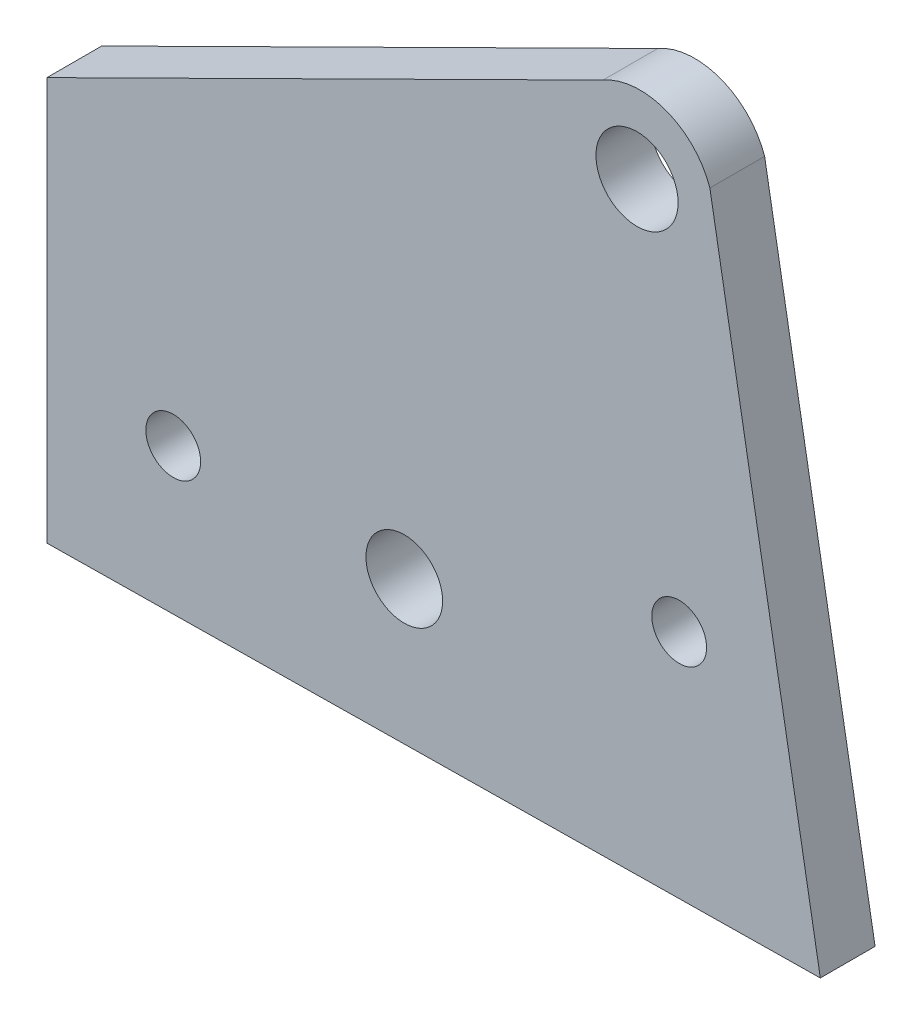
ISO-10303-21;
HEADER;
FILE_DESCRIPTION(('STEP AP214'),'2;1');
FILE_NAME('part.step','',(''),(''),'','','');
FILE_SCHEMA(('AUTOMOTIVE_DESIGN { 1 0 10303 214 1 1 1 1 }'));
ENDSEC;
DATA;
#1=APPLICATION_CONTEXT('core data for automotive mechanical design processes');
#2=APPLICATION_PROTOCOL_DEFINITION('international standard','automotive_design',2000,#1);
#3=PRODUCT_CONTEXT('',#1,'mechanical');
#4=PRODUCT('Part','Part','',(#3));
#5=PRODUCT_RELATED_PRODUCT_CATEGORY('part','',(#4));
#6=PRODUCT_DEFINITION_FORMATION('','',#4);
#7=PRODUCT_DEFINITION_CONTEXT('part definition',#1,'design');
#8=PRODUCT_DEFINITION('design','',#6,#7);
#9=PRODUCT_DEFINITION_SHAPE('','',#8);
#10=(LENGTH_UNIT() NAMED_UNIT(*) SI_UNIT(.MILLI.,.METRE.));
#11=(NAMED_UNIT(*) PLANE_ANGLE_UNIT() SI_UNIT($,.RADIAN.));
#12=(NAMED_UNIT(*) SI_UNIT($,.STERADIAN.) SOLID_ANGLE_UNIT());
#13=UNCERTAINTY_MEASURE_WITH_UNIT(LENGTH_MEASURE(1.E-05),#10,'distance_accuracy_value','');
#14=(GEOMETRIC_REPRESENTATION_CONTEXT(3) GLOBAL_UNCERTAINTY_ASSIGNED_CONTEXT((#13)) GLOBAL_UNIT_ASSIGNED_CONTEXT((#10,
#11,#12)) REPRESENTATION_CONTEXT('',''));
#15=CARTESIAN_POINT('',(0.,0.,0.));
#16=DIRECTION('',(0.,0.,1.));
#17=DIRECTION('',(1.,0.,0.));
#18=AXIS2_PLACEMENT_3D('',#15,#16,#17);
#19=CARTESIAN_POINT('',(-25.2182447600107,16.1874954298186,3.));
#20=DIRECTION('',(0.,0.,1.));
#21=DIRECTION('',(1.,0.,0.));
#22=AXIS2_PLACEMENT_3D('',#19,#20,#21);
#23=PLANE('',#22);
#24=CARTESIAN_POINT('',(-38.1318178832002,-9.42155377075159,3.));
#25=DIRECTION('',(0.,0.,1.));
#26=DIRECTION('',(1.,0.,0.));
#27=AXIS2_PLACEMENT_3D('',#24,#25,#26);
#28=CIRCLE('',#27,2.09999999999999);
#29=CARTESIAN_POINT('',(-36.0318178832002,-9.42155377075159,3.));
#30=VERTEX_POINT('',#29);
#31=EDGE_CURVE('E188',#30,#30,#28,.T.);
#32=ORIENTED_EDGE('',*,*,#31,.F.);
#33=EDGE_LOOP('',(#32));
#34=FACE_BOUND('',#33,.T.);
#35=CARTESIAN_POINT('',(-23.0715020259005,-4.4000567634974,3.));
#36=DIRECTION('',(0.,0.,1.));
#37=DIRECTION('',(1.,0.,0.));
#38=AXIS2_PLACEMENT_3D('',#35,#36,#37);
#39=CIRCLE('',#38,1.5);
#40=CARTESIAN_POINT('',(-21.5715020259005,-4.4000567634974,3.));
#41=VERTEX_POINT('',#40);
#42=EDGE_CURVE('E129',#41,#41,#39,.T.);
#43=ORIENTED_EDGE('',*,*,#42,.F.);
#44=EDGE_LOOP('',(#43));
#45=FACE_BOUND('',#44,.T.);
#46=CARTESIAN_POINT('',(-25.2182447600107,16.1874954298186,3.));
#47=DIRECTION('',(0.,0.,1.));
#48=DIRECTION('',(1.,0.,0.));
#49=AXIS2_PLACEMENT_3D('',#46,#47,#48);
#50=CIRCLE('',#49,4.04503526554854);
#51=CARTESIAN_POINT('',(-21.3908393679764,17.4964179884744,3.));
#52=VERTEX_POINT('',#51);
#53=CARTESIAN_POINT('',(-27.2485410989254,19.6860961609283,3.));
#54=VERTEX_POINT('',#53);
#55=EDGE_CURVE('E132',#52,#54,#50,.T.);
#56=ORIENTED_EDGE('',*,*,#55,.T.);
#57=DIRECTION('',(-0.895799736306299,-0.444457908506043,0.));
#58=VECTOR('',#57,1.);
#59=CARTESIAN_POINT('',(-27.2485410989254,19.6860961609283,3.));
#60=LINE('',#59,#58);
#61=CARTESIAN_POINT('',(-57.7075351426822,4.57363269481127,3.));
#62=VERTEX_POINT('',#61);
#63=EDGE_CURVE('E102',#54,#62,#60,.T.);
#64=ORIENTED_EDGE('',*,*,#63,.T.);
#65=DIRECTION('',(0.,-1.,0.));
#66=VECTOR('',#65,1.);
#67=CARTESIAN_POINT('',(-57.7075351426822,4.57363269481127,3.));
#68=LINE('',#67,#66);
#69=CARTESIAN_POINT('',(-57.7075351426822,-17.5103686240081,3.));
#70=VERTEX_POINT('',#69);
#71=EDGE_CURVE('E103',#62,#70,#68,.T.);
#72=ORIENTED_EDGE('',*,*,#71,.T.);
#73=DIRECTION('',(0.999914768407248,0.0130558768790045,0.));
#74=VECTOR('',#73,1.);
#75=CARTESIAN_POINT('',(-57.7075351426822,-17.5103686240081,3.));
#76=LINE('',#75,#74);
#77=CARTESIAN_POINT('',(-15.3402728475604,-16.9571797146107,3.));
#78=VERTEX_POINT('',#77);
#79=EDGE_CURVE('E106',#70,#78,#76,.T.);
#80=ORIENTED_EDGE('',*,*,#79,.T.);
#81=DIRECTION('',(-0.172967975598911,0.984927448808903,0.));
#82=VECTOR('',#81,1.);
#83=CARTESIAN_POINT('',(-15.3402728475604,-16.9571797146107,3.));
#84=LINE('',#83,#82);
#85=EDGE_CURVE('E70',#78,#52,#84,.T.);
#86=ORIENTED_EDGE('',*,*,#85,.T.);
#87=EDGE_LOOP('',(#56,#64,#72,#80,#86));
#88=FACE_BOUND('',#87,.T.);
#89=CARTESIAN_POINT('',(-50.7876816678338,-9.43546118851268,3.));
#90=DIRECTION('',(0.,0.,1.));
#91=DIRECTION('',(1.,0.,0.));
#92=AXIS2_PLACEMENT_3D('',#89,#90,#91);
#93=CIRCLE('',#92,1.5);
#94=CARTESIAN_POINT('',(-49.2876816678338,-9.43546118851268,3.));
#95=VERTEX_POINT('',#94);
#96=EDGE_CURVE('E193',#95,#95,#93,.T.);
#97=ORIENTED_EDGE('',*,*,#96,.F.);
#98=EDGE_LOOP('',(#97));
#99=FACE_BOUND('',#98,.T.);
#100=CARTESIAN_POINT('',(-25.3818178832002,15.9237372684417,3.));
#101=DIRECTION('',(0.,0.,1.));
#102=DIRECTION('',(1.,0.,0.));
#103=AXIS2_PLACEMENT_3D('',#100,#101,#102);
#104=CIRCLE('',#103,2.25000000000001);
#105=CARTESIAN_POINT('',(-23.1318178832002,15.9237372684417,3.));
#106=VERTEX_POINT('',#105);
#107=EDGE_CURVE('E179',#106,#106,#104,.T.);
#108=ORIENTED_EDGE('',*,*,#107,.F.);
#109=EDGE_LOOP('',(#108));
#110=FACE_BOUND('',#109,.T.);
#111=ADVANCED_FACE('F49',(#34,#45,#88,#99,#110),#23,.T.);
#112=CARTESIAN_POINT('',(-25.2182447600107,16.1874954298186,0.));
#113=DIRECTION('',(0.,0.,1.));
#114=DIRECTION('',(1.,0.,0.));
#115=AXIS2_PLACEMENT_3D('',#112,#113,#114);
#116=PLANE('',#115);
#117=CARTESIAN_POINT('',(-25.2182447600107,16.1874954298186,0.));
#118=DIRECTION('',(0.,0.,1.));
#119=DIRECTION('',(1.,0.,0.));
#120=AXIS2_PLACEMENT_3D('',#117,#118,#119);
#121=CIRCLE('',#120,4.04503526554854);
#122=CARTESIAN_POINT('',(-21.3908393679764,17.4964179884744,0.));
#123=VERTEX_POINT('',#122);
#124=CARTESIAN_POINT('',(-27.2485410989254,19.6860961609283,0.));
#125=VERTEX_POINT('',#124);
#126=EDGE_CURVE('E124',#123,#125,#121,.T.);
#127=ORIENTED_EDGE('',*,*,#126,.F.);
#128=DIRECTION('',(-0.172967975598911,0.984927448808903,0.));
#129=VECTOR('',#128,1.);
#130=CARTESIAN_POINT('',(-15.3402728475604,-16.9571797146107,0.));
#131=LINE('',#130,#129);
#132=CARTESIAN_POINT('',(-15.3402728475604,-16.9571797146107,0.));
#133=VERTEX_POINT('',#132);
#134=EDGE_CURVE('E93',#133,#123,#131,.T.);
#135=ORIENTED_EDGE('',*,*,#134,.F.);
#136=DIRECTION('',(0.999914768407248,0.0130558768790045,0.));
#137=VECTOR('',#136,1.);
#138=CARTESIAN_POINT('',(-57.7075351426822,-17.5103686240081,0.));
#139=LINE('',#138,#137);
#140=CARTESIAN_POINT('',(-57.7075351426822,-17.5103686240081,0.));
#141=VERTEX_POINT('',#140);
#142=EDGE_CURVE('E90',#141,#133,#139,.T.);
#143=ORIENTED_EDGE('',*,*,#142,.F.);
#144=DIRECTION('',(0.,-1.,0.));
#145=VECTOR('',#144,1.);
#146=CARTESIAN_POINT('',(-57.7075351426822,4.57363269481127,0.));
#147=LINE('',#146,#145);
#148=CARTESIAN_POINT('',(-57.7075351426822,4.57363269481127,0.));
#149=VERTEX_POINT('',#148);
#150=EDGE_CURVE('E117',#149,#141,#147,.T.);
#151=ORIENTED_EDGE('',*,*,#150,.F.);
#152=DIRECTION('',(-0.895799736306299,-0.444457908506043,0.));
#153=VECTOR('',#152,1.);
#154=CARTESIAN_POINT('',(-27.2485410989254,19.6860961609283,0.));
#155=LINE('',#154,#153);
#156=EDGE_CURVE('E126',#125,#149,#155,.T.);
#157=ORIENTED_EDGE('',*,*,#156,.F.);
#158=EDGE_LOOP('',(#127,#135,#143,#151,#157));
#159=FACE_BOUND('',#158,.T.);
#160=CARTESIAN_POINT('',(-23.0715020259005,-4.4000567634974,0.));
#161=DIRECTION('',(0.,0.,1.));
#162=DIRECTION('',(1.,0.,0.));
#163=AXIS2_PLACEMENT_3D('',#160,#161,#162);
#164=CIRCLE('',#163,1.5);
#165=CARTESIAN_POINT('',(-21.5715020259005,-4.4000567634974,0.));
#166=VERTEX_POINT('',#165);
#167=EDGE_CURVE('E200',#166,#166,#164,.T.);
#168=ORIENTED_EDGE('',*,*,#167,.T.);
#169=EDGE_LOOP('',(#168));
#170=FACE_BOUND('',#169,.T.);
#171=CARTESIAN_POINT('',(-50.7876816678338,-9.43546118851268,0.));
#172=DIRECTION('',(0.,0.,1.));
#173=DIRECTION('',(1.,0.,0.));
#174=AXIS2_PLACEMENT_3D('',#171,#172,#173);
#175=CIRCLE('',#174,1.5);
#176=CARTESIAN_POINT('',(-49.2876816678338,-9.43546118851268,0.));
#177=VERTEX_POINT('',#176);
#178=EDGE_CURVE('E195',#177,#177,#175,.T.);
#179=ORIENTED_EDGE('',*,*,#178,.T.);
#180=EDGE_LOOP('',(#179));
#181=FACE_BOUND('',#180,.T.);
#182=CARTESIAN_POINT('',(-38.1318178832002,-9.42155377075159,0.));
#183=DIRECTION('',(0.,0.,1.));
#184=DIRECTION('',(1.,0.,0.));
#185=AXIS2_PLACEMENT_3D('',#182,#183,#184);
#186=CIRCLE('',#185,2.09999999999999);
#187=CARTESIAN_POINT('',(-36.0318178832002,-9.42155377075159,0.));
#188=VERTEX_POINT('',#187);
#189=EDGE_CURVE('E186',#188,#188,#186,.T.);
#190=ORIENTED_EDGE('',*,*,#189,.T.);
#191=EDGE_LOOP('',(#190));
#192=FACE_BOUND('',#191,.T.);
#193=CARTESIAN_POINT('',(-25.3818178832002,15.9237372684417,0.));
#194=DIRECTION('',(0.,0.,1.));
#195=DIRECTION('',(1.,0.,0.));
#196=AXIS2_PLACEMENT_3D('',#193,#194,#195);
#197=CIRCLE('',#196,2.25000000000001);
#198=CARTESIAN_POINT('',(-23.1318178832002,15.9237372684417,0.));
#199=VERTEX_POINT('',#198);
#200=EDGE_CURVE('E183',#199,#199,#197,.T.);
#201=ORIENTED_EDGE('',*,*,#200,.T.);
#202=EDGE_LOOP('',(#201));
#203=FACE_BOUND('',#202,.T.);
#204=ADVANCED_FACE('F138',(#159,#170,#181,#192,#203),#116,.F.);
#205=CARTESIAN_POINT('',(-25.2182447600107,16.1874954298186,3.));
#206=DIRECTION('',(0.,0.,-1.));
#207=DIRECTION('',(-1.,0.,0.));
#208=AXIS2_PLACEMENT_3D('',#205,#206,#207);
#209=CYLINDRICAL_SURFACE('',#208,4.04503526554854);
#210=ORIENTED_EDGE('',*,*,#126,.T.);
#211=DIRECTION('',(0.,0.,-1.));
#212=VECTOR('',#211,1.);
#213=CARTESIAN_POINT('',(-27.2485410989254,19.6860961609283,3.));
#214=LINE('',#213,#212);
#215=EDGE_CURVE('E12',#54,#125,#214,.T.);
#216=ORIENTED_EDGE('',*,*,#215,.F.);
#217=ORIENTED_EDGE('',*,*,#55,.F.);
#218=DIRECTION('',(0.,0.,-1.));
#219=VECTOR('',#218,1.);
#220=CARTESIAN_POINT('',(-21.3908393679764,17.4964179884744,3.));
#221=LINE('',#220,#219);
#222=EDGE_CURVE('E123',#52,#123,#221,.T.);
#223=ORIENTED_EDGE('',*,*,#222,.T.);
#224=EDGE_LOOP('',(#210,#216,#217,#223));
#225=FACE_BOUND('',#224,.T.);
#226=ADVANCED_FACE('F55',(#225),#209,.T.);
#227=CARTESIAN_POINT('',(-27.2485410989254,19.6860961609283,3.));
#228=DIRECTION('',(0.444457908506043,-0.895799736306298,0.));
#229=DIRECTION('',(0.895799736306299,0.444457908506043,0.));
#230=AXIS2_PLACEMENT_3D('',#227,#228,#229);
#231=PLANE('',#230);
#232=ORIENTED_EDGE('',*,*,#156,.T.);
#233=DIRECTION('',(0.,0.,-1.));
#234=VECTOR('',#233,1.);
#235=CARTESIAN_POINT('',(-57.7075351426822,4.57363269481127,3.));
#236=LINE('',#235,#234);
#237=EDGE_CURVE('E56',#62,#149,#236,.T.);
#238=ORIENTED_EDGE('',*,*,#237,.F.);
#239=ORIENTED_EDGE('',*,*,#63,.F.);
#240=ORIENTED_EDGE('',*,*,#215,.T.);
#241=EDGE_LOOP('',(#232,#238,#239,#240));
#242=FACE_BOUND('',#241,.T.);
#243=ADVANCED_FACE('F252',(#242),#231,.F.);
#244=CARTESIAN_POINT('',(-57.7075351426822,4.57363269481127,3.));
#245=DIRECTION('',(1.,0.,0.));
#246=DIRECTION('',(0.,0.,-1.));
#247=AXIS2_PLACEMENT_3D('',#244,#245,#246);
#248=PLANE('',#247);
#249=ORIENTED_EDGE('',*,*,#150,.T.);
#250=DIRECTION('',(0.,0.,-1.));
#251=VECTOR('',#250,1.);
#252=CARTESIAN_POINT('',(-57.7075351426822,-17.5103686240081,3.));
#253=LINE('',#252,#251);
#254=EDGE_CURVE('E111',#70,#141,#253,.T.);
#255=ORIENTED_EDGE('',*,*,#254,.F.);
#256=ORIENTED_EDGE('',*,*,#71,.F.);
#257=ORIENTED_EDGE('',*,*,#237,.T.);
#258=EDGE_LOOP('',(#249,#255,#256,#257));
#259=FACE_BOUND('',#258,.T.);
#260=ADVANCED_FACE('F114',(#259),#248,.F.);
#261=CARTESIAN_POINT('',(-57.7075351426822,-17.5103686240081,3.));
#262=DIRECTION('',(-0.0130558768790045,0.999914768407248,0.));
#263=DIRECTION('',(-0.999914768407248,-0.0130558768790045,0.));
#264=AXIS2_PLACEMENT_3D('',#261,#262,#263);
#265=PLANE('',#264);
#266=ORIENTED_EDGE('',*,*,#142,.T.);
#267=DIRECTION('',(0.,0.,-1.));
#268=VECTOR('',#267,1.);
#269=CARTESIAN_POINT('',(-15.3402728475604,-16.9571797146107,3.));
#270=LINE('',#269,#268);
#271=EDGE_CURVE('E119',#78,#133,#270,.T.);
#272=ORIENTED_EDGE('',*,*,#271,.F.);
#273=ORIENTED_EDGE('',*,*,#79,.F.);
#274=ORIENTED_EDGE('',*,*,#254,.T.);
#275=EDGE_LOOP('',(#266,#272,#273,#274));
#276=FACE_BOUND('',#275,.T.);
#277=ADVANCED_FACE('F116',(#276),#265,.F.);
#278=CARTESIAN_POINT('',(-15.3402728475604,-16.9571797146107,3.));
#279=DIRECTION('',(-0.984927448808903,-0.172967975598911,0.));
#280=DIRECTION('',(0.172967975598911,-0.984927448808903,0.));
#281=AXIS2_PLACEMENT_3D('',#278,#279,#280);
#282=PLANE('',#281);
#283=ORIENTED_EDGE('',*,*,#134,.T.);
#284=ORIENTED_EDGE('',*,*,#222,.F.);
#285=ORIENTED_EDGE('',*,*,#85,.F.);
#286=ORIENTED_EDGE('',*,*,#271,.T.);
#287=EDGE_LOOP('',(#283,#284,#285,#286));
#288=FACE_BOUND('',#287,.T.);
#289=ADVANCED_FACE('F142',(#288),#282,.F.);
#290=CARTESIAN_POINT('',(-23.0715020259005,-4.4000567634974,3.));
#291=DIRECTION('',(0.,0.,-1.));
#292=DIRECTION('',(-1.,0.,0.));
#293=AXIS2_PLACEMENT_3D('',#290,#291,#292);
#294=CYLINDRICAL_SURFACE('',#293,1.5);
#295=ORIENTED_EDGE('',*,*,#42,.T.);
#296=EDGE_LOOP('',(#295));
#297=FACE_BOUND('',#296,.T.);
#298=ORIENTED_EDGE('',*,*,#167,.F.);
#299=EDGE_LOOP('',(#298));
#300=FACE_BOUND('',#299,.T.);
#301=ADVANCED_FACE('F144',(#297,#300),#294,.F.);
#302=CARTESIAN_POINT('',(-50.7876816678338,-9.43546118851268,3.));
#303=DIRECTION('',(0.,0.,-1.));
#304=DIRECTION('',(-1.,0.,0.));
#305=AXIS2_PLACEMENT_3D('',#302,#303,#304);
#306=CYLINDRICAL_SURFACE('',#305,1.5);
#307=ORIENTED_EDGE('',*,*,#96,.T.);
#308=EDGE_LOOP('',(#307));
#309=FACE_BOUND('',#308,.T.);
#310=ORIENTED_EDGE('',*,*,#178,.F.);
#311=EDGE_LOOP('',(#310));
#312=FACE_BOUND('',#311,.T.);
#313=ADVANCED_FACE('F152',(#309,#312),#306,.F.);
#314=CARTESIAN_POINT('',(-38.1318178832002,-9.42155377075159,3.));
#315=DIRECTION('',(0.,0.,-1.));
#316=DIRECTION('',(-1.,0.,0.));
#317=AXIS2_PLACEMENT_3D('',#314,#315,#316);
#318=CYLINDRICAL_SURFACE('',#317,2.09999999999999);
#319=ORIENTED_EDGE('',*,*,#31,.T.);
#320=EDGE_LOOP('',(#319));
#321=FACE_BOUND('',#320,.T.);
#322=ORIENTED_EDGE('',*,*,#189,.F.);
#323=EDGE_LOOP('',(#322));
#324=FACE_BOUND('',#323,.T.);
#325=ADVANCED_FACE('F167',(#321,#324),#318,.F.);
#326=CARTESIAN_POINT('',(-25.3818178832002,15.9237372684417,3.));
#327=DIRECTION('',(0.,0.,-1.));
#328=DIRECTION('',(-1.,0.,0.));
#329=AXIS2_PLACEMENT_3D('',#326,#327,#328);
#330=CYLINDRICAL_SURFACE('',#329,2.25000000000001);
#331=ORIENTED_EDGE('',*,*,#107,.T.);
#332=EDGE_LOOP('',(#331));
#333=FACE_BOUND('',#332,.T.);
#334=ORIENTED_EDGE('',*,*,#200,.F.);
#335=EDGE_LOOP('',(#334));
#336=FACE_BOUND('',#335,.T.);
#337=ADVANCED_FACE('F173',(#333,#336),#330,.F.);
#338=CLOSED_SHELL('',(#111,#204,#226,#243,#260,#277,#289,#301,#313,#325,#337));
#339=MANIFOLD_SOLID_BREP('B2',#338);
#340=ADVANCED_BREP_SHAPE_REPRESENTATION('',(#18,#339),#14);
#341=SHAPE_DEFINITION_REPRESENTATION(#9,#340);
ENDSEC;
END-ISO-10303-21;
